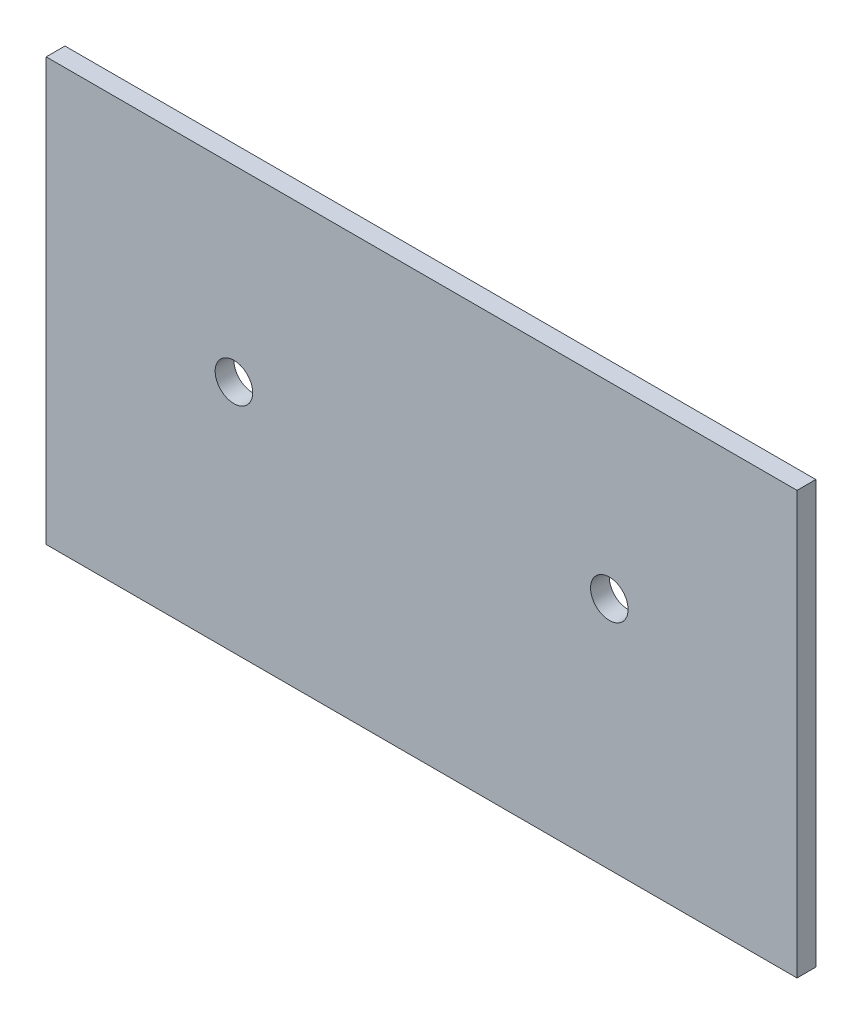
ISO-10303-21;
HEADER;
FILE_DESCRIPTION(('STEP AP214'),'2;1');
FILE_NAME('part.step','',(''),(''),'','','');
FILE_SCHEMA(('AUTOMOTIVE_DESIGN { 1 0 10303 214 1 1 1 1 }'));
ENDSEC;
DATA;
#1=APPLICATION_CONTEXT('core data for automotive mechanical design processes');
#2=APPLICATION_PROTOCOL_DEFINITION('international standard','automotive_design',2000,#1);
#3=PRODUCT_CONTEXT('',#1,'mechanical');
#4=PRODUCT('Part','Part','',(#3));
#5=PRODUCT_RELATED_PRODUCT_CATEGORY('part','',(#4));
#6=PRODUCT_DEFINITION_FORMATION('','',#4);
#7=PRODUCT_DEFINITION_CONTEXT('part definition',#1,'design');
#8=PRODUCT_DEFINITION('design','',#6,#7);
#9=PRODUCT_DEFINITION_SHAPE('','',#8);
#10=(LENGTH_UNIT() NAMED_UNIT(*) SI_UNIT(.MILLI.,.METRE.));
#11=(NAMED_UNIT(*) PLANE_ANGLE_UNIT() SI_UNIT($,.RADIAN.));
#12=(NAMED_UNIT(*) SI_UNIT($,.STERADIAN.) SOLID_ANGLE_UNIT());
#13=UNCERTAINTY_MEASURE_WITH_UNIT(LENGTH_MEASURE(1.E-05),#10,'distance_accuracy_value','');
#14=(GEOMETRIC_REPRESENTATION_CONTEXT(3) GLOBAL_UNCERTAINTY_ASSIGNED_CONTEXT((#13)) GLOBAL_UNIT_ASSIGNED_CONTEXT((#10,
#11,#12)) REPRESENTATION_CONTEXT('',''));
#15=CARTESIAN_POINT('',(0.,0.,0.));
#16=DIRECTION('',(0.,0.,1.));
#17=DIRECTION('',(1.,0.,0.));
#18=AXIS2_PLACEMENT_3D('',#15,#16,#17);
#19=CARTESIAN_POINT('',(40.,22.5,2.));
#20=DIRECTION('',(-1.,0.,0.));
#21=DIRECTION('',(0.,0.,1.));
#22=AXIS2_PLACEMENT_3D('',#19,#20,#21);
#23=PLANE('',#22);
#24=DIRECTION('',(0.,1.,0.));
#25=VECTOR('',#24,1.);
#26=CARTESIAN_POINT('',(40.,22.5,0.));
#27=LINE('',#26,#25);
#28=CARTESIAN_POINT('',(40.,-22.5,0.));
#29=VERTEX_POINT('',#28);
#30=CARTESIAN_POINT('',(40.,22.5,0.));
#31=VERTEX_POINT('',#30);
#32=EDGE_CURVE('E97',#29,#31,#27,.T.);
#33=ORIENTED_EDGE('',*,*,#32,.T.);
#34=DIRECTION('',(0.,0.,-1.));
#35=VECTOR('',#34,1.);
#36=CARTESIAN_POINT('',(40.,22.5,2.));
#37=LINE('',#36,#35);
#38=CARTESIAN_POINT('',(40.,22.5,2.));
#39=VERTEX_POINT('',#38);
#40=EDGE_CURVE('E11',#39,#31,#37,.T.);
#41=ORIENTED_EDGE('',*,*,#40,.F.);
#42=DIRECTION('',(0.,1.,0.));
#43=VECTOR('',#42,1.);
#44=CARTESIAN_POINT('',(40.,22.5,2.));
#45=LINE('',#44,#43);
#46=CARTESIAN_POINT('',(40.,-22.5,2.));
#47=VERTEX_POINT('',#46);
#48=EDGE_CURVE('E85',#47,#39,#45,.T.);
#49=ORIENTED_EDGE('',*,*,#48,.F.);
#50=DIRECTION('',(0.,0.,-1.));
#51=VECTOR('',#50,1.);
#52=CARTESIAN_POINT('',(40.,-22.5,2.));
#53=LINE('',#52,#51);
#54=EDGE_CURVE('E93',#47,#29,#53,.T.);
#55=ORIENTED_EDGE('',*,*,#54,.T.);
#56=EDGE_LOOP('',(#33,#41,#49,#55));
#57=FACE_BOUND('',#56,.T.);
#58=ADVANCED_FACE('F34',(#57),#23,.F.);
#59=CARTESIAN_POINT('',(-40.,22.5,2.));
#60=DIRECTION('',(0.,-1.,0.));
#61=DIRECTION('',(0.,0.,-1.));
#62=AXIS2_PLACEMENT_3D('',#59,#60,#61);
#63=PLANE('',#62);
#64=DIRECTION('',(-1.,0.,0.));
#65=VECTOR('',#64,1.);
#66=CARTESIAN_POINT('',(-40.,22.5,0.));
#67=LINE('',#66,#65);
#68=CARTESIAN_POINT('',(-40.,22.5,0.));
#69=VERTEX_POINT('',#68);
#70=EDGE_CURVE('E89',#31,#69,#67,.T.);
#71=ORIENTED_EDGE('',*,*,#70,.T.);
#72=DIRECTION('',(0.,0.,-1.));
#73=VECTOR('',#72,1.);
#74=CARTESIAN_POINT('',(-40.,22.5,2.));
#75=LINE('',#74,#73);
#76=CARTESIAN_POINT('',(-40.,22.5,2.));
#77=VERTEX_POINT('',#76);
#78=EDGE_CURVE('E42',#77,#69,#75,.T.);
#79=ORIENTED_EDGE('',*,*,#78,.F.);
#80=DIRECTION('',(-1.,0.,0.));
#81=VECTOR('',#80,1.);
#82=CARTESIAN_POINT('',(-40.,22.5,2.));
#83=LINE('',#82,#81);
#84=EDGE_CURVE('E80',#39,#77,#83,.T.);
#85=ORIENTED_EDGE('',*,*,#84,.F.);
#86=ORIENTED_EDGE('',*,*,#40,.T.);
#87=EDGE_LOOP('',(#71,#79,#85,#86));
#88=FACE_BOUND('',#87,.T.);
#89=ADVANCED_FACE('F88',(#88),#63,.F.);
#90=CARTESIAN_POINT('',(-40.,22.5,2.));
#91=DIRECTION('',(1.,0.,0.));
#92=DIRECTION('',(0.,1.,0.));
#93=AXIS2_PLACEMENT_3D('',#90,#91,#92);
#94=PLANE('',#93);
#95=DIRECTION('',(0.,-1.,0.));
#96=VECTOR('',#95,1.);
#97=CARTESIAN_POINT('',(-40.,22.5,0.));
#98=LINE('',#97,#96);
#99=CARTESIAN_POINT('',(-40.,-22.5,0.));
#100=VERTEX_POINT('',#99);
#101=EDGE_CURVE('E67',#69,#100,#98,.T.);
#102=ORIENTED_EDGE('',*,*,#101,.T.);
#103=DIRECTION('',(0.,0.,-1.));
#104=VECTOR('',#103,1.);
#105=CARTESIAN_POINT('',(-40.,-22.5,2.));
#106=LINE('',#105,#104);
#107=CARTESIAN_POINT('',(-40.,-22.5,2.));
#108=VERTEX_POINT('',#107);
#109=EDGE_CURVE('E90',#108,#100,#106,.T.);
#110=ORIENTED_EDGE('',*,*,#109,.F.);
#111=DIRECTION('',(0.,-1.,0.));
#112=VECTOR('',#111,1.);
#113=CARTESIAN_POINT('',(-40.,22.5,2.));
#114=LINE('',#113,#112);
#115=EDGE_CURVE('E83',#77,#108,#114,.T.);
#116=ORIENTED_EDGE('',*,*,#115,.F.);
#117=ORIENTED_EDGE('',*,*,#78,.T.);
#118=EDGE_LOOP('',(#102,#110,#116,#117));
#119=FACE_BOUND('',#118,.T.);
#120=ADVANCED_FACE('F91',(#119),#94,.F.);
#121=CARTESIAN_POINT('',(-40.,-22.5,2.));
#122=DIRECTION('',(0.,1.,0.));
#123=DIRECTION('',(0.,0.,1.));
#124=AXIS2_PLACEMENT_3D('',#121,#122,#123);
#125=PLANE('',#124);
#126=DIRECTION('',(1.,0.,0.));
#127=VECTOR('',#126,1.);
#128=CARTESIAN_POINT('',(-40.,-22.5,0.));
#129=LINE('',#128,#127);
#130=EDGE_CURVE('E73',#100,#29,#129,.T.);
#131=ORIENTED_EDGE('',*,*,#130,.T.);
#132=ORIENTED_EDGE('',*,*,#54,.F.);
#133=DIRECTION('',(1.,0.,0.));
#134=VECTOR('',#133,1.);
#135=CARTESIAN_POINT('',(-40.,-22.5,2.));
#136=LINE('',#135,#134);
#137=EDGE_CURVE('E50',#108,#47,#136,.T.);
#138=ORIENTED_EDGE('',*,*,#137,.F.);
#139=ORIENTED_EDGE('',*,*,#109,.T.);
#140=EDGE_LOOP('',(#131,#132,#138,#139));
#141=FACE_BOUND('',#140,.T.);
#142=ADVANCED_FACE('F105',(#141),#125,.F.);
#143=CARTESIAN_POINT('',(0.,0.,2.));
#144=DIRECTION('',(0.,0.,1.));
#145=DIRECTION('',(1.,0.,0.));
#146=AXIS2_PLACEMENT_3D('',#143,#144,#145);
#147=PLANE('',#146);
#148=CARTESIAN_POINT('',(-20.,2.5,2.));
#149=DIRECTION('',(0.,0.,1.));
#150=DIRECTION('',(1.,0.,0.));
#151=AXIS2_PLACEMENT_3D('',#148,#149,#150);
#152=CIRCLE('',#151,2.00000000000001);
#153=CARTESIAN_POINT('',(-18.,2.5,2.));
#154=VERTEX_POINT('',#153);
#155=EDGE_CURVE('E117',#154,#154,#152,.T.);
#156=ORIENTED_EDGE('',*,*,#155,.F.);
#157=EDGE_LOOP('',(#156));
#158=FACE_BOUND('',#157,.T.);
#159=CARTESIAN_POINT('',(20.,2.5,2.));
#160=DIRECTION('',(0.,0.,1.));
#161=DIRECTION('',(1.,0.,0.));
#162=AXIS2_PLACEMENT_3D('',#159,#160,#161);
#163=CIRCLE('',#162,2.);
#164=CARTESIAN_POINT('',(22.,2.5,2.));
#165=VERTEX_POINT('',#164);
#166=EDGE_CURVE('E111',#165,#165,#163,.T.);
#167=ORIENTED_EDGE('',*,*,#166,.F.);
#168=EDGE_LOOP('',(#167));
#169=FACE_BOUND('',#168,.T.);
#170=ORIENTED_EDGE('',*,*,#48,.T.);
#171=ORIENTED_EDGE('',*,*,#84,.T.);
#172=ORIENTED_EDGE('',*,*,#115,.T.);
#173=ORIENTED_EDGE('',*,*,#137,.T.);
#174=EDGE_LOOP('',(#170,#171,#172,#173));
#175=FACE_BOUND('',#174,.T.);
#176=ADVANCED_FACE('F81',(#158,#169,#175),#147,.T.);
#177=CARTESIAN_POINT('',(0.,0.,0.));
#178=DIRECTION('',(0.,0.,1.));
#179=DIRECTION('',(1.,0.,0.));
#180=AXIS2_PLACEMENT_3D('',#177,#178,#179);
#181=PLANE('',#180);
#182=CARTESIAN_POINT('',(-20.,2.5,0.));
#183=DIRECTION('',(0.,0.,1.));
#184=DIRECTION('',(1.,0.,0.));
#185=AXIS2_PLACEMENT_3D('',#182,#183,#184);
#186=CIRCLE('',#185,2.00000000000001);
#187=CARTESIAN_POINT('',(-18.,2.5,0.));
#188=VERTEX_POINT('',#187);
#189=EDGE_CURVE('E100',#188,#188,#186,.T.);
#190=ORIENTED_EDGE('',*,*,#189,.T.);
#191=EDGE_LOOP('',(#190));
#192=FACE_BOUND('',#191,.T.);
#193=CARTESIAN_POINT('',(20.,2.5,0.));
#194=DIRECTION('',(0.,0.,1.));
#195=DIRECTION('',(1.,0.,0.));
#196=AXIS2_PLACEMENT_3D('',#193,#194,#195);
#197=CIRCLE('',#196,2.);
#198=CARTESIAN_POINT('',(22.,2.5,0.));
#199=VERTEX_POINT('',#198);
#200=EDGE_CURVE('E114',#199,#199,#197,.T.);
#201=ORIENTED_EDGE('',*,*,#200,.T.);
#202=EDGE_LOOP('',(#201));
#203=FACE_BOUND('',#202,.T.);
#204=ORIENTED_EDGE('',*,*,#32,.F.);
#205=ORIENTED_EDGE('',*,*,#130,.F.);
#206=ORIENTED_EDGE('',*,*,#101,.F.);
#207=ORIENTED_EDGE('',*,*,#70,.F.);
#208=EDGE_LOOP('',(#204,#205,#206,#207));
#209=FACE_BOUND('',#208,.T.);
#210=ADVANCED_FACE('F108',(#192,#203,#209),#181,.F.);
#211=CARTESIAN_POINT('',(20.,2.5,0.));
#212=DIRECTION('',(0.,0.,1.));
#213=DIRECTION('',(1.,0.,0.));
#214=AXIS2_PLACEMENT_3D('',#211,#212,#213);
#215=CYLINDRICAL_SURFACE('',#214,2.);
#216=ORIENTED_EDGE('',*,*,#200,.F.);
#217=EDGE_LOOP('',(#216));
#218=FACE_BOUND('',#217,.T.);
#219=ORIENTED_EDGE('',*,*,#166,.T.);
#220=EDGE_LOOP('',(#219));
#221=FACE_BOUND('',#220,.T.);
#222=ADVANCED_FACE('F128',(#218,#221),#215,.F.);
#223=CARTESIAN_POINT('',(-20.,2.5,0.));
#224=DIRECTION('',(0.,0.,1.));
#225=DIRECTION('',(1.,0.,0.));
#226=AXIS2_PLACEMENT_3D('',#223,#224,#225);
#227=CYLINDRICAL_SURFACE('',#226,2.00000000000001);
#228=ORIENTED_EDGE('',*,*,#189,.F.);
#229=EDGE_LOOP('',(#228));
#230=FACE_BOUND('',#229,.T.);
#231=ORIENTED_EDGE('',*,*,#155,.T.);
#232=EDGE_LOOP('',(#231));
#233=FACE_BOUND('',#232,.T.);
#234=ADVANCED_FACE('F125',(#230,#233),#227,.F.);
#235=CLOSED_SHELL('',(#58,#89,#120,#142,#176,#210,#222,#234));
#236=MANIFOLD_SOLID_BREP('B2',#235);
#237=ADVANCED_BREP_SHAPE_REPRESENTATION('',(#18,#236),#14);
#238=SHAPE_DEFINITION_REPRESENTATION(#9,#237);
ENDSEC;
END-ISO-10303-21;
